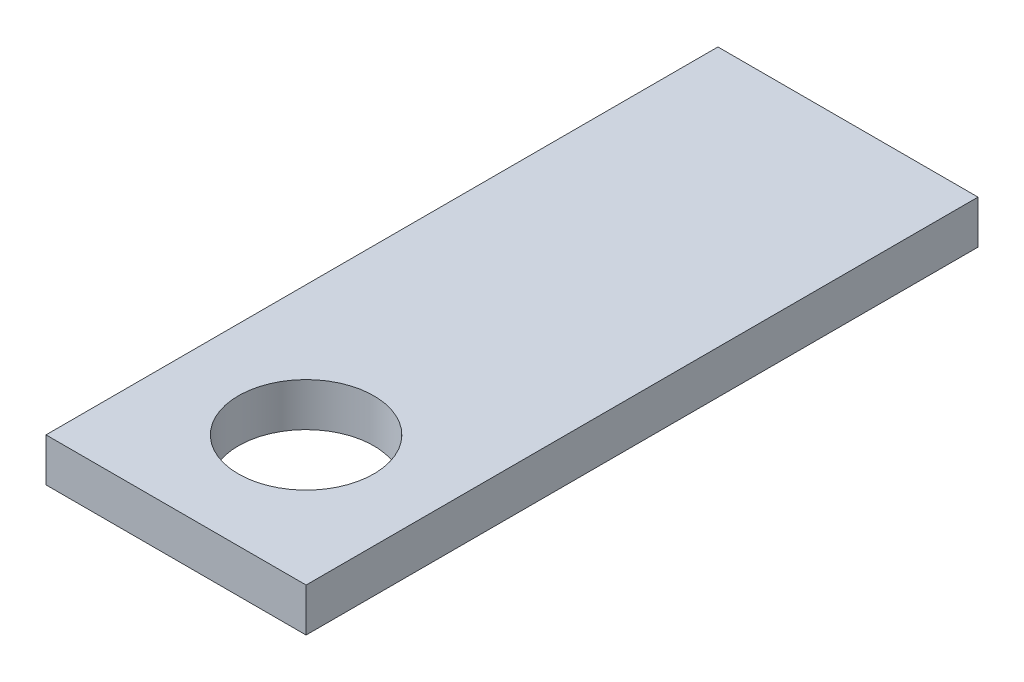
ISO-10303-21;
HEADER;
FILE_DESCRIPTION(('STEP AP214'),'2;1');
FILE_NAME('part.step','',(''),(''),'','','');
FILE_SCHEMA(('AUTOMOTIVE_DESIGN { 1 0 10303 214 1 1 1 1 }'));
ENDSEC;
DATA;
#1=APPLICATION_CONTEXT('core data for automotive mechanical design processes');
#2=APPLICATION_PROTOCOL_DEFINITION('international standard','automotive_design',2000,#1);
#3=PRODUCT_CONTEXT('',#1,'mechanical');
#4=PRODUCT('Part','Part','',(#3));
#5=PRODUCT_RELATED_PRODUCT_CATEGORY('part','',(#4));
#6=PRODUCT_DEFINITION_FORMATION('','',#4);
#7=PRODUCT_DEFINITION_CONTEXT('part definition',#1,'design');
#8=PRODUCT_DEFINITION('design','',#6,#7);
#9=PRODUCT_DEFINITION_SHAPE('','',#8);
#10=(LENGTH_UNIT() NAMED_UNIT(*) SI_UNIT(.MILLI.,.METRE.));
#11=(NAMED_UNIT(*) PLANE_ANGLE_UNIT() SI_UNIT($,.RADIAN.));
#12=(NAMED_UNIT(*) SI_UNIT($,.STERADIAN.) SOLID_ANGLE_UNIT());
#13=UNCERTAINTY_MEASURE_WITH_UNIT(LENGTH_MEASURE(1.E-05),#10,'distance_accuracy_value','');
#14=(GEOMETRIC_REPRESENTATION_CONTEXT(3) GLOBAL_UNCERTAINTY_ASSIGNED_CONTEXT((#13)) GLOBAL_UNIT_ASSIGNED_CONTEXT((#10,
#11,#12)) REPRESENTATION_CONTEXT('',''));
#15=CARTESIAN_POINT('',(0.,0.,0.));
#16=DIRECTION('',(0.,0.,1.));
#17=DIRECTION('',(1.,0.,0.));
#18=AXIS2_PLACEMENT_3D('',#15,#16,#17);
#19=CARTESIAN_POINT('',(19.05,-3.17499999999999,98.425));
#20=DIRECTION('',(-1.,0.,0.));
#21=DIRECTION('',(0.,0.,1.));
#22=AXIS2_PLACEMENT_3D('',#19,#20,#21);
#23=PLANE('',#22);
#24=DIRECTION('',(0.,1.,0.));
#25=VECTOR('',#24,1.);
#26=CARTESIAN_POINT('',(19.05,-3.17499999999999,0.));
#27=LINE('',#26,#25);
#28=CARTESIAN_POINT('',(19.05,-3.17499999999999,0.));
#29=VERTEX_POINT('',#28);
#30=CARTESIAN_POINT('',(19.05,3.17500000000001,0.));
#31=VERTEX_POINT('',#30);
#32=EDGE_CURVE('E98',#29,#31,#27,.T.);
#33=ORIENTED_EDGE('',*,*,#32,.T.);
#34=DIRECTION('',(0.,0.,-1.));
#35=VECTOR('',#34,1.);
#36=CARTESIAN_POINT('',(19.05,3.17500000000001,98.425));
#37=LINE('',#36,#35);
#38=CARTESIAN_POINT('',(19.05,3.17500000000001,98.425));
#39=VERTEX_POINT('',#38);
#40=EDGE_CURVE('E11',#39,#31,#37,.T.);
#41=ORIENTED_EDGE('',*,*,#40,.F.);
#42=DIRECTION('',(0.,1.,0.));
#43=VECTOR('',#42,1.);
#44=CARTESIAN_POINT('',(19.05,-3.17499999999999,98.425));
#45=LINE('',#44,#43);
#46=CARTESIAN_POINT('',(19.05,-3.17499999999999,98.425));
#47=VERTEX_POINT('',#46);
#48=EDGE_CURVE('E86',#47,#39,#45,.T.);
#49=ORIENTED_EDGE('',*,*,#48,.F.);
#50=DIRECTION('',(0.,0.,-1.));
#51=VECTOR('',#50,1.);
#52=CARTESIAN_POINT('',(19.05,-3.17499999999999,98.425));
#53=LINE('',#52,#51);
#54=EDGE_CURVE('E94',#47,#29,#53,.T.);
#55=ORIENTED_EDGE('',*,*,#54,.T.);
#56=EDGE_LOOP('',(#33,#41,#49,#55));
#57=FACE_BOUND('',#56,.T.);
#58=ADVANCED_FACE('F35',(#57),#23,.F.);
#59=CARTESIAN_POINT('',(-19.05,3.17500000000001,98.425));
#60=DIRECTION('',(0.,-1.,0.));
#61=DIRECTION('',(0.,0.,-1.));
#62=AXIS2_PLACEMENT_3D('',#59,#60,#61);
#63=PLANE('',#62);
#64=CARTESIAN_POINT('',(0.,3.17500000000001,79.375));
#65=DIRECTION('',(0.,1.,0.));
#66=DIRECTION('',(0.,0.,1.));
#67=AXIS2_PLACEMENT_3D('',#64,#65,#66);
#68=CIRCLE('',#67,9.92124);
#69=CARTESIAN_POINT('',(0.,3.17500000000001,89.29624));
#70=VERTEX_POINT('',#69);
#71=EDGE_CURVE('E114',#70,#70,#68,.T.);
#72=ORIENTED_EDGE('',*,*,#71,.F.);
#73=EDGE_LOOP('',(#72));
#74=FACE_BOUND('',#73,.T.);
#75=DIRECTION('',(-1.,0.,0.));
#76=VECTOR('',#75,1.);
#77=CARTESIAN_POINT('',(-19.05,3.17500000000001,0.));
#78=LINE('',#77,#76);
#79=CARTESIAN_POINT('',(-19.05,3.17500000000001,0.));
#80=VERTEX_POINT('',#79);
#81=EDGE_CURVE('E90',#31,#80,#78,.T.);
#82=ORIENTED_EDGE('',*,*,#81,.T.);
#83=DIRECTION('',(0.,0.,-1.));
#84=VECTOR('',#83,1.);
#85=CARTESIAN_POINT('',(-19.05,3.17500000000001,98.425));
#86=LINE('',#85,#84);
#87=CARTESIAN_POINT('',(-19.05,3.17500000000001,98.425));
#88=VERTEX_POINT('',#87);
#89=EDGE_CURVE('E43',#88,#80,#86,.T.);
#90=ORIENTED_EDGE('',*,*,#89,.F.);
#91=DIRECTION('',(-1.,0.,0.));
#92=VECTOR('',#91,1.);
#93=CARTESIAN_POINT('',(-19.05,3.17500000000001,98.425));
#94=LINE('',#93,#92);
#95=EDGE_CURVE('E81',#39,#88,#94,.T.);
#96=ORIENTED_EDGE('',*,*,#95,.F.);
#97=ORIENTED_EDGE('',*,*,#40,.T.);
#98=EDGE_LOOP('',(#82,#90,#96,#97));
#99=FACE_BOUND('',#98,.T.);
#100=ADVANCED_FACE('F89',(#74,#99),#63,.F.);
#101=CARTESIAN_POINT('',(-19.05,-3.17499999999999,98.425));
#102=DIRECTION('',(1.,0.,0.));
#103=DIRECTION('',(0.,0.,-1.));
#104=AXIS2_PLACEMENT_3D('',#101,#102,#103);
#105=PLANE('',#104);
#106=DIRECTION('',(0.,-1.,0.));
#107=VECTOR('',#106,1.);
#108=CARTESIAN_POINT('',(-19.05,-3.17499999999999,0.));
#109=LINE('',#108,#107);
#110=CARTESIAN_POINT('',(-19.05,-3.17499999999999,0.));
#111=VERTEX_POINT('',#110);
#112=EDGE_CURVE('E68',#80,#111,#109,.T.);
#113=ORIENTED_EDGE('',*,*,#112,.T.);
#114=DIRECTION('',(0.,0.,-1.));
#115=VECTOR('',#114,1.);
#116=CARTESIAN_POINT('',(-19.05,-3.17499999999999,98.425));
#117=LINE('',#116,#115);
#118=CARTESIAN_POINT('',(-19.05,-3.17499999999999,98.425));
#119=VERTEX_POINT('',#118);
#120=EDGE_CURVE('E91',#119,#111,#117,.T.);
#121=ORIENTED_EDGE('',*,*,#120,.F.);
#122=DIRECTION('',(0.,-1.,0.));
#123=VECTOR('',#122,1.);
#124=CARTESIAN_POINT('',(-19.05,-3.17499999999999,98.425));
#125=LINE('',#124,#123);
#126=EDGE_CURVE('E84',#88,#119,#125,.T.);
#127=ORIENTED_EDGE('',*,*,#126,.F.);
#128=ORIENTED_EDGE('',*,*,#89,.T.);
#129=EDGE_LOOP('',(#113,#121,#127,#128));
#130=FACE_BOUND('',#129,.T.);
#131=ADVANCED_FACE('F92',(#130),#105,.F.);
#132=CARTESIAN_POINT('',(-19.05,-3.17499999999999,98.425));
#133=DIRECTION('',(0.,1.,0.));
#134=DIRECTION('',(0.,0.,1.));
#135=AXIS2_PLACEMENT_3D('',#132,#133,#134);
#136=PLANE('',#135);
#137=CARTESIAN_POINT('',(0.,-3.17499999999999,79.375));
#138=DIRECTION('',(0.,1.,0.));
#139=DIRECTION('',(0.,0.,1.));
#140=AXIS2_PLACEMENT_3D('',#137,#138,#139);
#141=CIRCLE('',#140,9.92124);
#142=CARTESIAN_POINT('',(0.,-3.17499999999999,89.29624));
#143=VERTEX_POINT('',#142);
#144=EDGE_CURVE('E101',#143,#143,#141,.T.);
#145=ORIENTED_EDGE('',*,*,#144,.T.);
#146=EDGE_LOOP('',(#145));
#147=FACE_BOUND('',#146,.T.);
#148=DIRECTION('',(1.,0.,0.));
#149=VECTOR('',#148,1.);
#150=CARTESIAN_POINT('',(-19.05,-3.17499999999999,0.));
#151=LINE('',#150,#149);
#152=EDGE_CURVE('E74',#111,#29,#151,.T.);
#153=ORIENTED_EDGE('',*,*,#152,.T.);
#154=ORIENTED_EDGE('',*,*,#54,.F.);
#155=DIRECTION('',(1.,0.,0.));
#156=VECTOR('',#155,1.);
#157=CARTESIAN_POINT('',(-19.05,-3.17499999999999,98.425));
#158=LINE('',#157,#156);
#159=EDGE_CURVE('E51',#119,#47,#158,.T.);
#160=ORIENTED_EDGE('',*,*,#159,.F.);
#161=ORIENTED_EDGE('',*,*,#120,.T.);
#162=EDGE_LOOP('',(#153,#154,#160,#161));
#163=FACE_BOUND('',#162,.T.);
#164=ADVANCED_FACE('F106',(#147,#163),#136,.F.);
#165=CARTESIAN_POINT('',(19.05,3.17500000000001,98.425));
#166=DIRECTION('',(0.,0.,-1.));
#167=DIRECTION('',(-1.,0.,0.));
#168=AXIS2_PLACEMENT_3D('',#165,#166,#167);
#169=PLANE('',#168);
#170=ORIENTED_EDGE('',*,*,#48,.T.);
#171=ORIENTED_EDGE('',*,*,#95,.T.);
#172=ORIENTED_EDGE('',*,*,#126,.T.);
#173=ORIENTED_EDGE('',*,*,#159,.T.);
#174=EDGE_LOOP('',(#170,#171,#172,#173));
#175=FACE_BOUND('',#174,.T.);
#176=ADVANCED_FACE('F82',(#175),#169,.F.);
#177=CARTESIAN_POINT('',(19.05,3.17500000000001,0.));
#178=DIRECTION('',(0.,0.,-1.));
#179=DIRECTION('',(-1.,0.,0.));
#180=AXIS2_PLACEMENT_3D('',#177,#178,#179);
#181=PLANE('',#180);
#182=ORIENTED_EDGE('',*,*,#32,.F.);
#183=ORIENTED_EDGE('',*,*,#152,.F.);
#184=ORIENTED_EDGE('',*,*,#112,.F.);
#185=ORIENTED_EDGE('',*,*,#81,.F.);
#186=EDGE_LOOP('',(#182,#183,#184,#185));
#187=FACE_BOUND('',#186,.T.);
#188=ADVANCED_FACE('F109',(#187),#181,.T.);
#189=CARTESIAN_POINT('',(0.,3.17500000000001,79.375));
#190=DIRECTION('',(0.,1.,0.));
#191=DIRECTION('',(0.,0.,1.));
#192=AXIS2_PLACEMENT_3D('',#189,#190,#191);
#193=CYLINDRICAL_SURFACE('',#192,9.92124);
#194=ORIENTED_EDGE('',*,*,#71,.T.);
#195=EDGE_LOOP('',(#194));
#196=FACE_BOUND('',#195,.T.);
#197=ORIENTED_EDGE('',*,*,#144,.F.);
#198=EDGE_LOOP('',(#197));
#199=FACE_BOUND('',#198,.T.);
#200=ADVANCED_FACE('F118',(#196,#199),#193,.F.);
#201=CLOSED_SHELL('',(#58,#100,#131,#164,#176,#188,#200));
#202=MANIFOLD_SOLID_BREP('B2',#201);
#203=ADVANCED_BREP_SHAPE_REPRESENTATION('',(#18,#202),#14);
#204=SHAPE_DEFINITION_REPRESENTATION(#9,#203);
ENDSEC;
END-ISO-10303-21;
